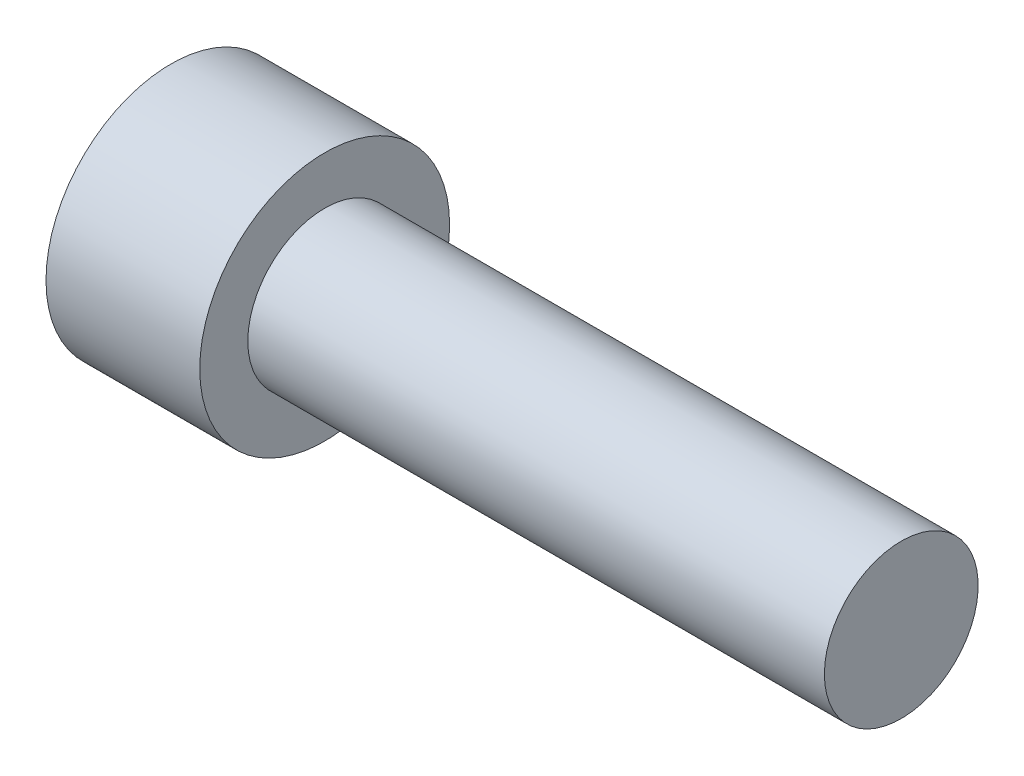
ISO-10303-21;
HEADER;
FILE_DESCRIPTION(('STEP AP214'),'2;1');
FILE_NAME('part.step','',(''),(''),'','','');
FILE_SCHEMA(('AUTOMOTIVE_DESIGN { 1 0 10303 214 1 1 1 1 }'));
ENDSEC;
DATA;
#1=APPLICATION_CONTEXT('core data for automotive mechanical design processes');
#2=APPLICATION_PROTOCOL_DEFINITION('international standard','automotive_design',2000,#1);
#3=PRODUCT_CONTEXT('',#1,'mechanical');
#4=PRODUCT('Part','Part','',(#3));
#5=PRODUCT_RELATED_PRODUCT_CATEGORY('part','',(#4));
#6=PRODUCT_DEFINITION_FORMATION('','',#4);
#7=PRODUCT_DEFINITION_CONTEXT('part definition',#1,'design');
#8=PRODUCT_DEFINITION('design','',#6,#7);
#9=PRODUCT_DEFINITION_SHAPE('','',#8);
#10=(LENGTH_UNIT() NAMED_UNIT(*) SI_UNIT(.MILLI.,.METRE.));
#11=(NAMED_UNIT(*) PLANE_ANGLE_UNIT() SI_UNIT($,.RADIAN.));
#12=(NAMED_UNIT(*) SI_UNIT($,.STERADIAN.) SOLID_ANGLE_UNIT());
#13=UNCERTAINTY_MEASURE_WITH_UNIT(LENGTH_MEASURE(1.E-05),#10,'distance_accuracy_value','');
#14=(GEOMETRIC_REPRESENTATION_CONTEXT(3) GLOBAL_UNCERTAINTY_ASSIGNED_CONTEXT((#13)) GLOBAL_UNIT_ASSIGNED_CONTEXT((#10,
#11,#12)) REPRESENTATION_CONTEXT('',''));
#15=CARTESIAN_POINT('',(0.,0.,0.));
#16=DIRECTION('',(0.,0.,1.));
#17=DIRECTION('',(1.,0.,0.));
#18=AXIS2_PLACEMENT_3D('',#15,#16,#17);
#19=CARTESIAN_POINT('',(0.,0.,0.));
#20=DIRECTION('',(1.,0.,0.));
#21=DIRECTION('',(0.,0.,-1.));
#22=AXIS2_PLACEMENT_3D('',#19,#20,#21);
#23=PLANE('',#22);
#24=CARTESIAN_POINT('',(0.,0.,0.));
#25=DIRECTION('',(-1.,0.,0.));
#26=DIRECTION('',(0.,0.,1.));
#27=AXIS2_PLACEMENT_3D('',#24,#25,#26);
#28=CIRCLE('',#27,6.5);
#29=CARTESIAN_POINT('',(0.,0.,6.5));
#30=VERTEX_POINT('',#29);
#31=EDGE_CURVE('E11',#30,#30,#28,.T.);
#32=ORIENTED_EDGE('',*,*,#31,.T.);
#33=EDGE_LOOP('',(#32));
#34=FACE_BOUND('',#33,.T.);
#35=DIRECTION('',(0.,0.5,0.866025403784439));
#36=VECTOR('',#35,1.);
#37=CARTESIAN_POINT('',(0.,-3.46410161513775,0.));
#38=LINE('',#37,#36);
#39=CARTESIAN_POINT('',(0.,-3.46410161513775,0.));
#40=VERTEX_POINT('',#39);
#41=CARTESIAN_POINT('',(0.,-1.73205080756888,3.));
#42=VERTEX_POINT('',#41);
#43=EDGE_CURVE('E152',#40,#42,#38,.T.);
#44=ORIENTED_EDGE('',*,*,#43,.F.);
#45=DIRECTION('',(0.,-0.5,0.866025403784439));
#46=VECTOR('',#45,1.);
#47=CARTESIAN_POINT('',(0.,-1.73205080756888,-3.));
#48=LINE('',#47,#46);
#49=CARTESIAN_POINT('',(0.,-1.73205080756888,-3.));
#50=VERTEX_POINT('',#49);
#51=EDGE_CURVE('E52',#50,#40,#48,.T.);
#52=ORIENTED_EDGE('',*,*,#51,.F.);
#53=DIRECTION('',(0.,-1.,0.));
#54=VECTOR('',#53,1.);
#55=CARTESIAN_POINT('',(0.,1.73205080756888,-3.));
#56=LINE('',#55,#54);
#57=CARTESIAN_POINT('',(0.,1.73205080756888,-3.));
#58=VERTEX_POINT('',#57);
#59=EDGE_CURVE('E122',#58,#50,#56,.T.);
#60=ORIENTED_EDGE('',*,*,#59,.F.);
#61=DIRECTION('',(0.,-0.5,-0.866025403784439));
#62=VECTOR('',#61,1.);
#63=CARTESIAN_POINT('',(0.,3.46410161513775,0.));
#64=LINE('',#63,#62);
#65=CARTESIAN_POINT('',(0.,3.46410161513775,0.));
#66=VERTEX_POINT('',#65);
#67=EDGE_CURVE('E158',#66,#58,#64,.T.);
#68=ORIENTED_EDGE('',*,*,#67,.F.);
#69=DIRECTION('',(0.,0.5,-0.866025403784439));
#70=VECTOR('',#69,1.);
#71=CARTESIAN_POINT('',(0.,1.73205080756888,3.));
#72=LINE('',#71,#70);
#73=CARTESIAN_POINT('',(0.,1.73205080756888,3.));
#74=VERTEX_POINT('',#73);
#75=EDGE_CURVE('E156',#74,#66,#72,.T.);
#76=ORIENTED_EDGE('',*,*,#75,.F.);
#77=DIRECTION('',(0.,1.,0.));
#78=VECTOR('',#77,1.);
#79=CARTESIAN_POINT('',(0.,-1.73205080756888,3.));
#80=LINE('',#79,#78);
#81=EDGE_CURVE('E154',#42,#74,#80,.T.);
#82=ORIENTED_EDGE('',*,*,#81,.F.);
#83=EDGE_LOOP('',(#44,#52,#60,#68,#76,#82));
#84=FACE_BOUND('',#83,.T.);
#85=ADVANCED_FACE('F38',(#34,#84),#23,.F.);
#86=CARTESIAN_POINT('',(0.,0.,0.));
#87=DIRECTION('',(-1.,0.,0.));
#88=DIRECTION('',(0.,0.,1.));
#89=AXIS2_PLACEMENT_3D('',#86,#87,#88);
#90=CYLINDRICAL_SURFACE('',#89,6.5);
#91=ORIENTED_EDGE('',*,*,#31,.F.);
#92=EDGE_LOOP('',(#91));
#93=FACE_BOUND('',#92,.T.);
#94=CARTESIAN_POINT('',(8.,0.,0.));
#95=DIRECTION('',(-1.,0.,0.));
#96=DIRECTION('',(0.,0.,1.));
#97=AXIS2_PLACEMENT_3D('',#94,#95,#96);
#98=CIRCLE('',#97,6.5);
#99=CARTESIAN_POINT('',(8.,0.,6.5));
#100=VERTEX_POINT('',#99);
#101=EDGE_CURVE('E45',#100,#100,#98,.T.);
#102=ORIENTED_EDGE('',*,*,#101,.T.);
#103=EDGE_LOOP('',(#102));
#104=FACE_BOUND('',#103,.T.);
#105=ADVANCED_FACE('F186',(#93,#104),#90,.T.);
#106=CARTESIAN_POINT('',(8.,4.,0.));
#107=DIRECTION('',(-1.,0.,0.));
#108=DIRECTION('',(0.,0.,1.));
#109=AXIS2_PLACEMENT_3D('',#106,#107,#108);
#110=PLANE('',#109);
#111=ORIENTED_EDGE('',*,*,#101,.F.);
#112=EDGE_LOOP('',(#111));
#113=FACE_BOUND('',#112,.T.);
#114=CARTESIAN_POINT('',(8.,0.,0.));
#115=DIRECTION('',(-1.,0.,0.));
#116=DIRECTION('',(0.,0.,1.));
#117=AXIS2_PLACEMENT_3D('',#114,#115,#116);
#118=CIRCLE('',#117,4.);
#119=CARTESIAN_POINT('',(8.,0.,4.));
#120=VERTEX_POINT('',#119);
#121=EDGE_CURVE('E181',#120,#120,#118,.T.);
#122=ORIENTED_EDGE('',*,*,#121,.T.);
#123=EDGE_LOOP('',(#122));
#124=FACE_BOUND('',#123,.T.);
#125=ADVANCED_FACE('F188',(#113,#124),#110,.F.);
#126=CARTESIAN_POINT('',(0.,0.,0.));
#127=DIRECTION('',(-1.,0.,0.));
#128=DIRECTION('',(0.,0.,1.));
#129=AXIS2_PLACEMENT_3D('',#126,#127,#128);
#130=CYLINDRICAL_SURFACE('',#129,4.);
#131=ORIENTED_EDGE('',*,*,#121,.F.);
#132=EDGE_LOOP('',(#131));
#133=FACE_BOUND('',#132,.T.);
#134=CARTESIAN_POINT('',(38.,0.,0.));
#135=DIRECTION('',(-1.,0.,0.));
#136=DIRECTION('',(0.,0.,1.));
#137=AXIS2_PLACEMENT_3D('',#134,#135,#136);
#138=CIRCLE('',#137,4.);
#139=CARTESIAN_POINT('',(38.,0.,4.));
#140=VERTEX_POINT('',#139);
#141=EDGE_CURVE('E177',#140,#140,#138,.T.);
#142=ORIENTED_EDGE('',*,*,#141,.T.);
#143=EDGE_LOOP('',(#142));
#144=FACE_BOUND('',#143,.T.);
#145=ADVANCED_FACE('F191',(#133,#144),#130,.T.);
#146=CARTESIAN_POINT('',(38.,4.,0.));
#147=DIRECTION('',(-1.,0.,0.));
#148=DIRECTION('',(0.,0.,1.));
#149=AXIS2_PLACEMENT_3D('',#146,#147,#148);
#150=PLANE('',#149);
#151=ORIENTED_EDGE('',*,*,#141,.F.);
#152=EDGE_LOOP('',(#151));
#153=FACE_BOUND('',#152,.T.);
#154=ADVANCED_FACE('F197',(#153),#150,.F.);
#155=CARTESIAN_POINT('',(4.,-1.73205080756888,-3.));
#156=DIRECTION('',(0.,-0.866025403784439,-0.5));
#157=DIRECTION('',(0.,0.5,-0.866025403784439));
#158=AXIS2_PLACEMENT_3D('',#155,#156,#157);
#159=PLANE('',#158);
#160=DIRECTION('',(0.,-0.5,0.866025403784439));
#161=VECTOR('',#160,1.);
#162=CARTESIAN_POINT('',(4.,-1.73205080756888,-3.));
#163=LINE('',#162,#161);
#164=CARTESIAN_POINT('',(4.,-1.73205080756888,-3.));
#165=VERTEX_POINT('',#164);
#166=CARTESIAN_POINT('',(4.,-2.59807621135332,-1.5));
#167=VERTEX_POINT('',#166);
#168=EDGE_CURVE('E121',#165,#167,#163,.T.);
#169=ORIENTED_EDGE('',*,*,#168,.F.);
#170=DIRECTION('',(-1.,0.,0.));
#171=VECTOR('',#170,1.);
#172=CARTESIAN_POINT('',(4.,-1.73205080756888,-3.));
#173=LINE('',#172,#171);
#174=EDGE_CURVE('E161',#165,#50,#173,.T.);
#175=ORIENTED_EDGE('',*,*,#174,.T.);
#176=ORIENTED_EDGE('',*,*,#51,.T.);
#177=DIRECTION('',(-1.,0.,0.));
#178=VECTOR('',#177,1.);
#179=CARTESIAN_POINT('',(4.,-3.46410161513775,0.));
#180=LINE('',#179,#178);
#181=CARTESIAN_POINT('',(4.,-3.46410161513775,0.));
#182=VERTEX_POINT('',#181);
#183=EDGE_CURVE('E124',#182,#40,#180,.T.);
#184=ORIENTED_EDGE('',*,*,#183,.F.);
#185=EDGE_CURVE('E113',#167,#182,#163,.T.);
#186=ORIENTED_EDGE('',*,*,#185,.F.);
#187=EDGE_LOOP('',(#169,#175,#176,#184,#186));
#188=FACE_BOUND('',#187,.T.);
#189=ADVANCED_FACE('F125',(#188),#159,.F.);
#190=CARTESIAN_POINT('',(4.,1.73205080756888,-3.));
#191=DIRECTION('',(0.,0.,-1.));
#192=DIRECTION('',(-1.,0.,0.));
#193=AXIS2_PLACEMENT_3D('',#190,#191,#192);
#194=PLANE('',#193);
#195=DIRECTION('',(0.,-1.,0.));
#196=VECTOR('',#195,1.);
#197=CARTESIAN_POINT('',(4.,1.73205080756888,-3.));
#198=LINE('',#197,#196);
#199=CARTESIAN_POINT('',(4.,1.73205080756888,-3.));
#200=VERTEX_POINT('',#199);
#201=CARTESIAN_POINT('',(4.,0.,-3.));
#202=VERTEX_POINT('',#201);
#203=EDGE_CURVE('E130',#200,#202,#198,.T.);
#204=ORIENTED_EDGE('',*,*,#203,.F.);
#205=DIRECTION('',(-1.,0.,0.));
#206=VECTOR('',#205,1.);
#207=CARTESIAN_POINT('',(4.,1.73205080756888,-3.));
#208=LINE('',#207,#206);
#209=EDGE_CURVE('E163',#200,#58,#208,.T.);
#210=ORIENTED_EDGE('',*,*,#209,.T.);
#211=ORIENTED_EDGE('',*,*,#59,.T.);
#212=ORIENTED_EDGE('',*,*,#174,.F.);
#213=EDGE_CURVE('E148',#202,#165,#198,.T.);
#214=ORIENTED_EDGE('',*,*,#213,.F.);
#215=EDGE_LOOP('',(#204,#210,#211,#212,#214));
#216=FACE_BOUND('',#215,.T.);
#217=ADVANCED_FACE('F206',(#216),#194,.F.);
#218=CARTESIAN_POINT('',(4.,3.46410161513775,0.));
#219=DIRECTION('',(0.,0.866025403784439,-0.5));
#220=DIRECTION('',(0.,0.5,0.866025403784439));
#221=AXIS2_PLACEMENT_3D('',#218,#219,#220);
#222=PLANE('',#221);
#223=DIRECTION('',(0.,-0.5,-0.866025403784439));
#224=VECTOR('',#223,1.);
#225=CARTESIAN_POINT('',(4.,3.46410161513775,0.));
#226=LINE('',#225,#224);
#227=CARTESIAN_POINT('',(4.,3.46410161513775,0.));
#228=VERTEX_POINT('',#227);
#229=CARTESIAN_POINT('',(4.,2.59807621135332,-1.5));
#230=VERTEX_POINT('',#229);
#231=EDGE_CURVE('E145',#228,#230,#226,.T.);
#232=ORIENTED_EDGE('',*,*,#231,.F.);
#233=DIRECTION('',(-1.,0.,0.));
#234=VECTOR('',#233,1.);
#235=CARTESIAN_POINT('',(4.,3.46410161513775,0.));
#236=LINE('',#235,#234);
#237=EDGE_CURVE('E166',#228,#66,#236,.T.);
#238=ORIENTED_EDGE('',*,*,#237,.T.);
#239=ORIENTED_EDGE('',*,*,#67,.T.);
#240=ORIENTED_EDGE('',*,*,#209,.F.);
#241=EDGE_CURVE('E144',#230,#200,#226,.T.);
#242=ORIENTED_EDGE('',*,*,#241,.F.);
#243=EDGE_LOOP('',(#232,#238,#239,#240,#242));
#244=FACE_BOUND('',#243,.T.);
#245=ADVANCED_FACE('F259',(#244),#222,.F.);
#246=CARTESIAN_POINT('',(4.,1.73205080756888,3.));
#247=DIRECTION('',(0.,0.866025403784439,0.5));
#248=DIRECTION('',(0.,-0.5,0.866025403784439));
#249=AXIS2_PLACEMENT_3D('',#246,#247,#248);
#250=PLANE('',#249);
#251=DIRECTION('',(0.,0.5,-0.866025403784439));
#252=VECTOR('',#251,1.);
#253=CARTESIAN_POINT('',(4.,1.73205080756888,3.));
#254=LINE('',#253,#252);
#255=CARTESIAN_POINT('',(4.,1.73205080756888,3.));
#256=VERTEX_POINT('',#255);
#257=CARTESIAN_POINT('',(4.,2.59807621135332,1.5));
#258=VERTEX_POINT('',#257);
#259=EDGE_CURVE('E141',#256,#258,#254,.T.);
#260=ORIENTED_EDGE('',*,*,#259,.F.);
#261=DIRECTION('',(-1.,0.,0.));
#262=VECTOR('',#261,1.);
#263=CARTESIAN_POINT('',(4.,1.73205080756888,3.));
#264=LINE('',#263,#262);
#265=EDGE_CURVE('E169',#256,#74,#264,.T.);
#266=ORIENTED_EDGE('',*,*,#265,.T.);
#267=ORIENTED_EDGE('',*,*,#75,.T.);
#268=ORIENTED_EDGE('',*,*,#237,.F.);
#269=EDGE_CURVE('E140',#258,#228,#254,.T.);
#270=ORIENTED_EDGE('',*,*,#269,.F.);
#271=EDGE_LOOP('',(#260,#266,#267,#268,#270));
#272=FACE_BOUND('',#271,.T.);
#273=ADVANCED_FACE('F254',(#272),#250,.F.);
#274=CARTESIAN_POINT('',(4.,-1.73205080756888,3.));
#275=DIRECTION('',(0.,0.,1.));
#276=DIRECTION('',(0.,-1.,0.));
#277=AXIS2_PLACEMENT_3D('',#274,#275,#276);
#278=PLANE('',#277);
#279=DIRECTION('',(0.,1.,0.));
#280=VECTOR('',#279,1.);
#281=CARTESIAN_POINT('',(4.,-1.73205080756888,3.));
#282=LINE('',#281,#280);
#283=CARTESIAN_POINT('',(4.,-1.73205080756888,3.));
#284=VERTEX_POINT('',#283);
#285=CARTESIAN_POINT('',(4.,0.,3.));
#286=VERTEX_POINT('',#285);
#287=EDGE_CURVE('E60',#284,#286,#282,.T.);
#288=ORIENTED_EDGE('',*,*,#287,.F.);
#289=DIRECTION('',(-1.,0.,0.));
#290=VECTOR('',#289,1.);
#291=CARTESIAN_POINT('',(4.,-1.73205080756888,3.));
#292=LINE('',#291,#290);
#293=EDGE_CURVE('E129',#284,#42,#292,.T.);
#294=ORIENTED_EDGE('',*,*,#293,.T.);
#295=ORIENTED_EDGE('',*,*,#81,.T.);
#296=ORIENTED_EDGE('',*,*,#265,.F.);
#297=EDGE_CURVE('E136',#286,#256,#282,.T.);
#298=ORIENTED_EDGE('',*,*,#297,.F.);
#299=EDGE_LOOP('',(#288,#294,#295,#296,#298));
#300=FACE_BOUND('',#299,.T.);
#301=ADVANCED_FACE('F220',(#300),#278,.F.);
#302=CARTESIAN_POINT('',(4.,-3.46410161513775,0.));
#303=DIRECTION('',(0.,-0.866025403784439,0.5));
#304=DIRECTION('',(0.,-0.5,-0.866025403784439));
#305=AXIS2_PLACEMENT_3D('',#302,#303,#304);
#306=PLANE('',#305);
#307=DIRECTION('',(0.,0.5,0.866025403784439));
#308=VECTOR('',#307,1.);
#309=CARTESIAN_POINT('',(4.,-3.46410161513775,0.));
#310=LINE('',#309,#308);
#311=CARTESIAN_POINT('',(4.,-2.59807621135332,1.5));
#312=VERTEX_POINT('',#311);
#313=EDGE_CURVE('E116',#182,#312,#310,.T.);
#314=ORIENTED_EDGE('',*,*,#313,.F.);
#315=ORIENTED_EDGE('',*,*,#183,.T.);
#316=ORIENTED_EDGE('',*,*,#43,.T.);
#317=ORIENTED_EDGE('',*,*,#293,.F.);
#318=EDGE_CURVE('E135',#312,#284,#310,.T.);
#319=ORIENTED_EDGE('',*,*,#318,.F.);
#320=EDGE_LOOP('',(#314,#315,#316,#317,#319));
#321=FACE_BOUND('',#320,.T.);
#322=ADVANCED_FACE('F133',(#321),#306,.F.);
#323=CARTESIAN_POINT('',(4.,0.,0.));
#324=DIRECTION('',(-1.,0.,0.));
#325=DIRECTION('',(0.,0.,1.));
#326=AXIS2_PLACEMENT_3D('',#323,#324,#325);
#327=PLANE('',#326);
#328=ORIENTED_EDGE('',*,*,#297,.T.);
#329=ORIENTED_EDGE('',*,*,#259,.T.);
#330=CARTESIAN_POINT('',(4.,0.,0.));
#331=DIRECTION('',(-1.,0.,0.));
#332=DIRECTION('',(0.,-1.,0.));
#333=AXIS2_PLACEMENT_3D('',#330,#331,#332);
#334=CIRCLE('',#333,3.);
#335=EDGE_CURVE('E178',#286,#258,#334,.T.);
#336=ORIENTED_EDGE('',*,*,#335,.F.);
#337=EDGE_LOOP('',(#328,#329,#336));
#338=FACE_BOUND('',#337,.T.);
#339=ADVANCED_FACE('F226',(#338),#327,.T.);
#340=ORIENTED_EDGE('',*,*,#269,.T.);
#341=ORIENTED_EDGE('',*,*,#231,.T.);
#342=EDGE_CURVE('E229',#258,#230,#334,.T.);
#343=ORIENTED_EDGE('',*,*,#342,.F.);
#344=EDGE_LOOP('',(#340,#341,#343));
#345=FACE_BOUND('',#344,.T.);
#346=ADVANCED_FACE('F243',(#345),#327,.T.);
#347=ORIENTED_EDGE('',*,*,#241,.T.);
#348=ORIENTED_EDGE('',*,*,#203,.T.);
#349=EDGE_CURVE('E273',#230,#202,#334,.T.);
#350=ORIENTED_EDGE('',*,*,#349,.F.);
#351=EDGE_LOOP('',(#347,#348,#350));
#352=FACE_BOUND('',#351,.T.);
#353=ADVANCED_FACE('F248',(#352),#327,.T.);
#354=ORIENTED_EDGE('',*,*,#213,.T.);
#355=ORIENTED_EDGE('',*,*,#168,.T.);
#356=EDGE_CURVE('E275',#202,#167,#334,.T.);
#357=ORIENTED_EDGE('',*,*,#356,.F.);
#358=EDGE_LOOP('',(#354,#355,#357));
#359=FACE_BOUND('',#358,.T.);
#360=ADVANCED_FACE('F240',(#359),#327,.T.);
#361=ORIENTED_EDGE('',*,*,#185,.T.);
#362=ORIENTED_EDGE('',*,*,#313,.T.);
#363=EDGE_CURVE('E118',#167,#312,#334,.T.);
#364=ORIENTED_EDGE('',*,*,#363,.F.);
#365=EDGE_LOOP('',(#361,#362,#364));
#366=FACE_BOUND('',#365,.T.);
#367=ADVANCED_FACE('F114',(#366),#327,.T.);
#368=ORIENTED_EDGE('',*,*,#318,.T.);
#369=ORIENTED_EDGE('',*,*,#287,.T.);
#370=EDGE_CURVE('E174',#312,#286,#334,.T.);
#371=ORIENTED_EDGE('',*,*,#370,.F.);
#372=EDGE_LOOP('',(#368,#369,#371));
#373=FACE_BOUND('',#372,.T.);
#374=ADVANCED_FACE('F233',(#373),#327,.T.);
#375=CARTESIAN_POINT('',(5.73205080756887,0.,0.));
#376=DIRECTION('',(-1.,0.,0.));
#377=DIRECTION('',(0.,-1.,0.));
#378=AXIS2_PLACEMENT_3D('',#375,#376,#377);
#379=CONICAL_SURFACE('',#378,0.,1.0471975511966);
#380=ORIENTED_EDGE('',*,*,#370,.T.);
#381=ORIENTED_EDGE('',*,*,#335,.T.);
#382=ORIENTED_EDGE('',*,*,#342,.T.);
#383=ORIENTED_EDGE('',*,*,#349,.T.);
#384=ORIENTED_EDGE('',*,*,#356,.T.);
#385=ORIENTED_EDGE('',*,*,#363,.T.);
#386=EDGE_LOOP('',(#380,#381,#382,#383,#384,#385));
#387=FACE_BOUND('',#386,.T.);
#388=CARTESIAN_POINT('',(5.73205080756887,0.,0.));
#389=VERTEX_POINT('',#388);
#390=VERTEX_LOOP('',#389);
#391=FACE_BOUND('',#390,.T.);
#392=ADVANCED_FACE('F230',(#387,#391),#379,.F.);
#393=CLOSED_SHELL('',(#85,#105,#125,#145,#154,#189,#217,#245,#273,#301,#322,#339,#346,#353,#360,
#367,#374,#392));
#394=MANIFOLD_SOLID_BREP('B2',#393);
#395=ADVANCED_BREP_SHAPE_REPRESENTATION('',(#18,#394),#14);
#396=SHAPE_DEFINITION_REPRESENTATION(#9,#395);
ENDSEC;
END-ISO-10303-21;
